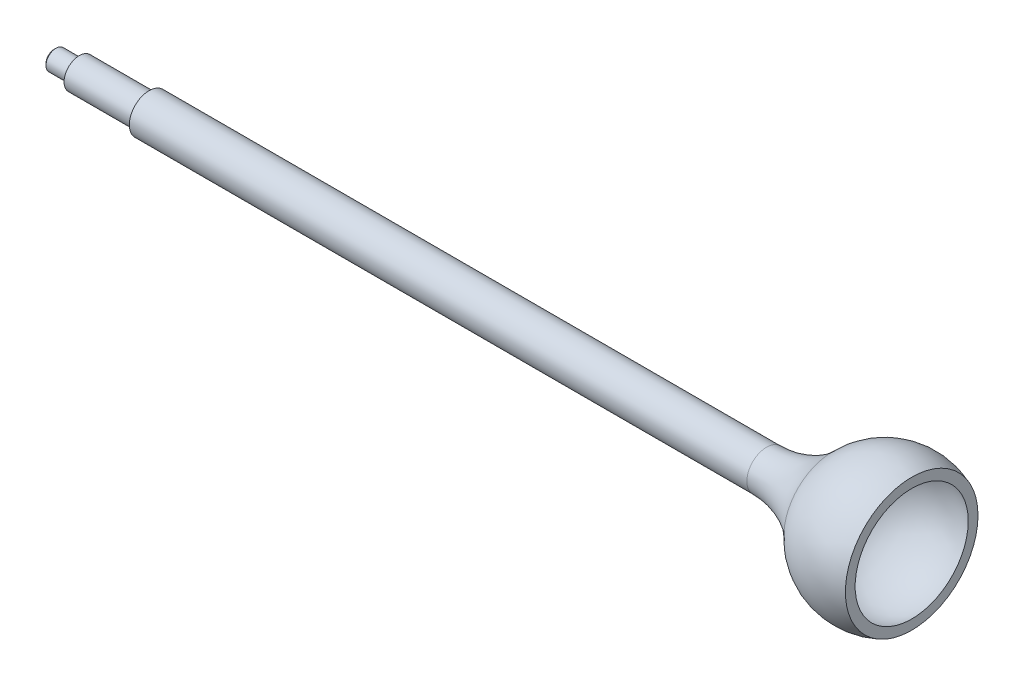
ISO-10303-21;
HEADER;
FILE_DESCRIPTION(('STEP AP214'),'2;1');
FILE_NAME('part.step','',(''),(''),'','','');
FILE_SCHEMA(('AUTOMOTIVE_DESIGN { 1 0 10303 214 1 1 1 1 }'));
ENDSEC;
DATA;
#1=APPLICATION_CONTEXT('core data for automotive mechanical design processes');
#2=APPLICATION_PROTOCOL_DEFINITION('international standard','automotive_design',2000,#1);
#3=PRODUCT_CONTEXT('',#1,'mechanical');
#4=PRODUCT('Part','Part','',(#3));
#5=PRODUCT_RELATED_PRODUCT_CATEGORY('part','',(#4));
#6=PRODUCT_DEFINITION_FORMATION('','',#4);
#7=PRODUCT_DEFINITION_CONTEXT('part definition',#1,'design');
#8=PRODUCT_DEFINITION('design','',#6,#7);
#9=PRODUCT_DEFINITION_SHAPE('','',#8);
#10=(LENGTH_UNIT() NAMED_UNIT(*) SI_UNIT(.MILLI.,.METRE.));
#11=(NAMED_UNIT(*) PLANE_ANGLE_UNIT() SI_UNIT($,.RADIAN.));
#12=(NAMED_UNIT(*) SI_UNIT($,.STERADIAN.) SOLID_ANGLE_UNIT());
#13=UNCERTAINTY_MEASURE_WITH_UNIT(LENGTH_MEASURE(1.E-05),#10,'distance_accuracy_value','');
#14=(GEOMETRIC_REPRESENTATION_CONTEXT(3) GLOBAL_UNCERTAINTY_ASSIGNED_CONTEXT((#13)) GLOBAL_UNIT_ASSIGNED_CONTEXT((#10,
#11,#12)) REPRESENTATION_CONTEXT('',''));
#15=CARTESIAN_POINT('',(0.,0.,0.));
#16=DIRECTION('',(0.,0.,1.));
#17=DIRECTION('',(1.,0.,0.));
#18=AXIS2_PLACEMENT_3D('',#15,#16,#17);
#19=CARTESIAN_POINT('',(411.5,0.,0.));
#20=DIRECTION('',(-1.,0.,0.));
#21=DIRECTION('',(0.,0.,-1.));
#22=AXIS2_PLACEMENT_3D('',#19,#20,#21);
#23=SPHERICAL_SURFACE('',#22,40.);
#24=CARTESIAN_POINT('',(382.089327543883,0.,0.));
#25=DIRECTION('',(1.,0.,0.));
#26=DIRECTION('',(0.,0.,-1.));
#27=AXIS2_PLACEMENT_3D('',#24,#25,#26);
#28=CIRCLE('',#27,27.1111111111111);
#29=CARTESIAN_POINT('',(382.089327543883,0.,-27.1111111111111));
#30=VERTEX_POINT('',#29);
#31=EDGE_CURVE('E48',#30,#30,#28,.T.);
#32=CARTESIAN_POINT('',(426.5,0.,0.));
#33=DIRECTION('',(-1.,0.,0.));
#34=DIRECTION('',(0.,0.,1.));
#35=AXIS2_PLACEMENT_3D('',#32,#33,#34);
#36=CIRCLE('',#35,37.0809924354783);
#37=CARTESIAN_POINT('',(426.5,0.,-37.0809924354783));
#38=VERTEX_POINT('',#37);
#39=EDGE_CURVE('E72',#38,#38,#36,.T.);
#40=CARTESIAN_POINT('',(382.089327543883,0.,-27.1111111111111));
#41=CARTESIAN_POINT('',(382.431166095148,0.,-27.4819515959781));
#42=CARTESIAN_POINT('',(382.780025288853,0.,-27.8463199316502));
#43=CARTESIAN_POINT('',(383.491270586963,0.,-28.5616061815372));
#44=CARTESIAN_POINT('',(383.853656691367,0.,-28.912524095752));
#45=CARTESIAN_POINT('',(384.591441436688,0.,-29.6004033796565));
#46=CARTESIAN_POINT('',(384.966840077606,0.,-29.9373647493461));
#47=CARTESIAN_POINT('',(385.730111719214,0.,-30.5968499449552));
#48=CARTESIAN_POINT('',(386.117984719904,0.,-30.9193737708747));
#49=CARTESIAN_POINT('',(386.905650446786,0.,-31.5495221538001));
#50=CARTESIAN_POINT('',(387.305443172979,0.,-31.8571467108062));
#51=CARTESIAN_POINT('',(388.116376290798,0.,-32.4570565172721));
#52=CARTESIAN_POINT('',(388.527516682425,0.,-32.7493417667319));
#53=CARTESIAN_POINT('',(389.36055693576,0.,-33.3181547661452));
#54=CARTESIAN_POINT('',(389.782456797467,0.,-33.5946825160986));
#55=CARTESIAN_POINT('',(390.636412375359,0.,-34.1315848952912));
#56=CARTESIAN_POINT('',(391.068468091543,0.,-34.3919595245304));
#57=CARTESIAN_POINT('',(391.942117240018,0.,-34.8961831441515));
#58=CARTESIAN_POINT('',(392.38371067231,0.,-35.1400321345333));
#59=CARTESIAN_POINT('',(393.27580346715,0.,-35.6108556033511));
#60=CARTESIAN_POINT('',(393.726302829698,0.,-35.837830081787));
#61=CARTESIAN_POINT('',(394.635562958049,0.,-36.2745797953899));
#62=CARTESIAN_POINT('',(395.094323723851,0.,-36.4843550305569));
#63=CARTESIAN_POINT('',(396.019450312019,0.,-36.8864061333049));
#64=CARTESIAN_POINT('',(396.485816134386,0.,-37.0786820008858));
#65=CARTESIAN_POINT('',(397.425485608516,0.,-37.4454592803625));
#66=CARTESIAN_POINT('',(397.898789260279,0.,-37.6199606922583));
#67=CARTESIAN_POINT('',(398.85165724011,0.,-37.9509394020974));
#68=CARTESIAN_POINT('',(399.331221568177,0.,-38.1074167000407));
#69=CARTESIAN_POINT('',(400.295924790407,0.,-38.4021233107118));
#70=CARTESIAN_POINT('',(400.781063684569,0.,-38.5403526234396));
#71=CARTESIAN_POINT('',(401.756221953277,0.,-38.7983654997157));
#72=CARTESIAN_POINT('',(402.246241327822,0.,-38.9181490632639));
#73=CARTESIAN_POINT('',(403.230459489106,0.,-39.1390990674545));
#74=CARTESIAN_POINT('',(403.724658275845,0.,-39.240265508097));
#75=CARTESIAN_POINT('',(404.716528213862,0.,-39.4238365281717));
#76=CARTESIAN_POINT('',(405.21419936514,0.,-39.5062411076039));
#77=CARTESIAN_POINT('',(406.212302016689,0.,-39.6521705094516));
#78=CARTESIAN_POINT('',(406.71273351696,0.,-39.7156953318671));
#79=CARTESIAN_POINT('',(407.71564090173,0.,-39.8237743350462));
#80=CARTESIAN_POINT('',(408.218116786229,0.,-39.86832851581));
#81=CARTESIAN_POINT('',(409.224394049799,0.,-39.9384024922467));
#82=CARTESIAN_POINT('',(409.72819542887,0.,-39.9639222879196));
#83=CARTESIAN_POINT('',(410.736402895557,0.,-39.9958909831449));
#84=CARTESIAN_POINT('',(411.240808983172,0.,-40.0023398826973));
#85=CARTESIAN_POINT('',(412.249504215746,0.,-39.9961575592357));
#86=CARTESIAN_POINT('',(412.753793360704,0.,-39.9835263362217));
#87=CARTESIAN_POINT('',(413.761533224141,0.,-39.939201839197));
#88=CARTESIAN_POINT('',(414.264983942618,0.,-39.9075085651863));
#89=CARTESIAN_POINT('',(415.270326668554,0.,-39.8251053090339));
#90=CARTESIAN_POINT('',(415.772218676011,0.,-39.7743953268921));
#91=CARTESIAN_POINT('',(416.773725926328,0.,-39.6540312069948));
#92=CARTESIAN_POINT('',(417.273341169186,0.,-39.5843770692392));
#93=CARTESIAN_POINT('',(418.269580090648,0.,-39.4262242844373));
#94=CARTESIAN_POINT('',(418.766203769252,0.,-39.3377256373909));
#95=CARTESIAN_POINT('',(419.75574905537,0.,-39.142010476527));
#96=CARTESIAN_POINT('',(420.248670662885,0.,-39.0347939627095));
#97=CARTESIAN_POINT('',(421.230106548736,0.,-38.8017963580599));
#98=CARTESIAN_POINT('',(421.718620827073,0.,-38.6760152672277));
#99=CARTESIAN_POINT('',(422.690543280366,0.,-38.40606885237));
#100=CARTESIAN_POINT('',(423.173951455322,0.,-38.2619035283445));
#101=CARTESIAN_POINT('',(424.134969567348,0.,-37.9553934501863));
#102=CARTESIAN_POINT('',(424.612579504418,0.,-37.7930486960537));
#103=CARTESIAN_POINT('',(425.561319785647,0.,-37.4504174480138));
#104=CARTESIAN_POINT('',(426.032450129806,0.,-37.2701309541066));
#105=CARTESIAN_POINT('',(426.5,0.,-37.0809924354783));
#106=B_SPLINE_CURVE_WITH_KNOTS('',3,(#40,#41,#42,#43,#44,#45,#46,#47,#48,#49,#50,#51,#52,#53,
#54,#55,#56,#57,#58,#59,#60,#61,#62,#63,#64,#65,#66,#67,#68,#69,#70,#71,#72,#73,#74,#75,#76,#77,
#78,#79,#80,#81,#82,#83,#84,#85,#86,#87,#88,#89,#90,#91,#92,#93,#94,#95,#96,#97,#98,#99,#100,
#101,#102,#103,#104,#105),.UNSPECIFIED.,.F.,.F.,(4,2,2,2,2,2,2,2,2,2,2,2,2,2,2,2,2,2,2,2,2,2,2,
2,2,2,2,2,2,2,2,2,4),(0.,1.5129810777724,3.0259621555448,4.53894323331724,6.05192431108964,
7.56490538886204,9.07788646663447,10.5908675444069,12.1038486221793,13.6168296999517,
15.1298107777241,16.6427918554965,18.155772933269,19.6687540110414,21.1817350888138,
22.6947161665862,24.2076972443586,25.720678322131,27.2336593999035,28.7466404776759,
30.2596215554483,31.7726026332207,33.2855837109931,34.7985647887655,36.311545866538,
37.8245269443104,39.3375080220828,40.8504890998552,42.3634701776276,43.8764512554001,
45.3894323331725,46.9024134109449,48.4153944887173),.UNSPECIFIED.);
#107=EDGE_CURVE('BSEAM40',#30,#38,#106,.T.);
#108=ORIENTED_EDGE('',*,*,#31,.T.);
#109=ORIENTED_EDGE('',*,*,#39,.T.);
#110=ORIENTED_EDGE('',*,*,#107,.T.);
#111=ORIENTED_EDGE('',*,*,#107,.F.);
#112=EDGE_LOOP('',(#108,#110,#109,#111));
#113=FACE_BOUND('',#112,.T.);
#114=ADVANCED_FACE('F40',(#113),#23,.T.);
#115=CARTESIAN_POINT('',(-53.,0.,0.));
#116=DIRECTION('',(-1.,0.,0.));
#117=DIRECTION('',(0.,0.,1.));
#118=AXIS2_PLACEMENT_3D('',#115,#116,#117);
#119=CYLINDRICAL_SURFACE('',#118,11.);
#120=CARTESIAN_POINT('',(345.325986973737,0.,0.));
#121=DIRECTION('',(1.,0.,0.));
#122=DIRECTION('',(0.,0.,-1.));
#123=AXIS2_PLACEMENT_3D('',#120,#121,#122);
#124=CIRCLE('',#123,11.);
#125=CARTESIAN_POINT('',(345.325986973737,0.,-11.));
#126=VERTEX_POINT('',#125);
#127=EDGE_CURVE('E10',#126,#126,#124,.F.);
#128=ORIENTED_EDGE('',*,*,#127,.T.);
#129=EDGE_LOOP('',(#128));
#130=FACE_BOUND('',#129,.T.);
#131=CARTESIAN_POINT('',(0.,0.,0.));
#132=DIRECTION('',(-1.,0.,0.));
#133=DIRECTION('',(0.,0.,1.));
#134=AXIS2_PLACEMENT_3D('',#131,#132,#133);
#135=CIRCLE('',#134,11.);
#136=CARTESIAN_POINT('',(0.,0.,11.));
#137=VERTEX_POINT('',#136);
#138=EDGE_CURVE('E66',#137,#137,#135,.T.);
#139=ORIENTED_EDGE('',*,*,#138,.F.);
#140=EDGE_LOOP('',(#139));
#141=FACE_BOUND('',#140,.T.);
#142=ADVANCED_FACE('F90',(#130,#141),#119,.T.);
#143=CARTESIAN_POINT('',(-53.,0.,0.));
#144=DIRECTION('',(-1.,0.,0.));
#145=DIRECTION('',(0.,0.,1.));
#146=AXIS2_PLACEMENT_3D('',#143,#144,#145);
#147=CYLINDRICAL_SURFACE('',#146,8.5);
#148=CARTESIAN_POINT('',(-39.,0.,0.));
#149=DIRECTION('',(-1.,0.,0.));
#150=DIRECTION('',(0.,0.,1.));
#151=AXIS2_PLACEMENT_3D('',#148,#149,#150);
#152=CIRCLE('',#151,8.5);
#153=CARTESIAN_POINT('',(-39.,0.,8.5));
#154=VERTEX_POINT('',#153);
#155=EDGE_CURVE('E60',#154,#154,#152,.T.);
#156=ORIENTED_EDGE('',*,*,#155,.F.);
#157=EDGE_LOOP('',(#156));
#158=FACE_BOUND('',#157,.T.);
#159=CARTESIAN_POINT('',(0.,0.,0.));
#160=DIRECTION('',(-1.,0.,0.));
#161=DIRECTION('',(0.,0.,1.));
#162=AXIS2_PLACEMENT_3D('',#159,#160,#161);
#163=CIRCLE('',#162,8.5);
#164=CARTESIAN_POINT('',(0.,0.,8.5));
#165=VERTEX_POINT('',#164);
#166=EDGE_CURVE('E69',#165,#165,#163,.T.);
#167=ORIENTED_EDGE('',*,*,#166,.T.);
#168=EDGE_LOOP('',(#167));
#169=FACE_BOUND('',#168,.T.);
#170=ADVANCED_FACE('F96',(#158,#169),#147,.T.);
#171=CARTESIAN_POINT('',(-39.,8.5,0.));
#172=DIRECTION('',(1.,0.,0.));
#173=DIRECTION('',(0.,0.,-1.));
#174=AXIS2_PLACEMENT_3D('',#171,#172,#173);
#175=PLANE('',#174);
#176=CARTESIAN_POINT('',(-39.,0.,0.));
#177=DIRECTION('',(-1.,0.,0.));
#178=DIRECTION('',(0.,0.,1.));
#179=AXIS2_PLACEMENT_3D('',#176,#177,#178);
#180=CIRCLE('',#179,5.6);
#181=CARTESIAN_POINT('',(-39.,0.,5.6));
#182=VERTEX_POINT('',#181);
#183=EDGE_CURVE('E63',#182,#182,#180,.T.);
#184=ORIENTED_EDGE('',*,*,#183,.F.);
#185=EDGE_LOOP('',(#184));
#186=FACE_BOUND('',#185,.T.);
#187=ORIENTED_EDGE('',*,*,#155,.T.);
#188=EDGE_LOOP('',(#187));
#189=FACE_BOUND('',#188,.T.);
#190=ADVANCED_FACE('F111',(#186,#189),#175,.F.);
#191=CARTESIAN_POINT('',(-53.,0.,0.));
#192=DIRECTION('',(-1.,0.,0.));
#193=DIRECTION('',(0.,0.,1.));
#194=AXIS2_PLACEMENT_3D('',#191,#192,#193);
#195=CYLINDRICAL_SURFACE('',#194,5.6);
#196=CARTESIAN_POINT('',(-52.,0.,0.));
#197=DIRECTION('',(1.,0.,0.));
#198=DIRECTION('',(0.,0.,-1.));
#199=AXIS2_PLACEMENT_3D('',#196,#197,#198);
#200=CIRCLE('',#199,5.6);
#201=CARTESIAN_POINT('',(-52.,0.,-5.6));
#202=VERTEX_POINT('',#201);
#203=EDGE_CURVE('E52',#202,#202,#200,.T.);
#204=ORIENTED_EDGE('',*,*,#203,.T.);
#205=EDGE_LOOP('',(#204));
#206=FACE_BOUND('',#205,.T.);
#207=ORIENTED_EDGE('',*,*,#183,.T.);
#208=EDGE_LOOP('',(#207));
#209=FACE_BOUND('',#208,.T.);
#210=ADVANCED_FACE('F107',(#206,#209),#195,.T.);
#211=CARTESIAN_POINT('',(-53.,5.6,0.));
#212=DIRECTION('',(1.,0.,0.));
#213=DIRECTION('',(0.,0.,-1.));
#214=AXIS2_PLACEMENT_3D('',#211,#212,#213);
#215=PLANE('',#214);
#216=CARTESIAN_POINT('',(-53.,0.,0.));
#217=DIRECTION('',(1.,0.,0.));
#218=DIRECTION('',(0.,0.,-1.));
#219=AXIS2_PLACEMENT_3D('',#216,#217,#218);
#220=CIRCLE('',#219,4.59999999999999);
#221=CARTESIAN_POINT('',(-53.,0.,-4.59999999999999));
#222=VERTEX_POINT('',#221);
#223=EDGE_CURVE('E57',#222,#222,#220,.F.);
#224=ORIENTED_EDGE('',*,*,#223,.T.);
#225=EDGE_LOOP('',(#224));
#226=FACE_BOUND('',#225,.T.);
#227=ADVANCED_FACE('F102',(#226),#215,.F.);
#228=CARTESIAN_POINT('',(0.,8.5,0.));
#229=DIRECTION('',(1.,0.,0.));
#230=DIRECTION('',(0.,0.,-1.));
#231=AXIS2_PLACEMENT_3D('',#228,#229,#230);
#232=PLANE('',#231);
#233=ORIENTED_EDGE('',*,*,#166,.F.);
#234=EDGE_LOOP('',(#233));
#235=FACE_BOUND('',#234,.T.);
#236=ORIENTED_EDGE('',*,*,#138,.T.);
#237=EDGE_LOOP('',(#236));
#238=FACE_BOUND('',#237,.T.);
#239=ADVANCED_FACE('F99',(#235,#238),#232,.F.);
#240=CARTESIAN_POINT('',(-53.,0.,0.));
#241=DIRECTION('',(1.,0.,0.));
#242=DIRECTION('',(0.,0.,-1.));
#243=AXIS2_PLACEMENT_3D('',#240,#241,#242);
#244=CONICAL_SURFACE('',#243,4.59999999999999,0.78539816339744);
#245=ORIENTED_EDGE('',*,*,#203,.F.);
#246=EDGE_LOOP('',(#245));
#247=FACE_BOUND('',#246,.T.);
#248=ORIENTED_EDGE('',*,*,#223,.F.);
#249=EDGE_LOOP('',(#248));
#250=FACE_BOUND('',#249,.T.);
#251=ADVANCED_FACE('F101',(#247,#250),#244,.T.);
#252=CARTESIAN_POINT('',(345.325986973737,0.,0.));
#253=DIRECTION('',(1.,0.,0.));
#254=DIRECTION('',(0.,0.,-1.));
#255=AXIS2_PLACEMENT_3D('',#252,#253,#254);
#256=TOROIDAL_SURFACE('',#255,61.,50.);
#257=ORIENTED_EDGE('',*,*,#127,.F.);
#258=EDGE_LOOP('',(#257));
#259=FACE_BOUND('',#258,.T.);
#260=ORIENTED_EDGE('',*,*,#31,.F.);
#261=EDGE_LOOP('',(#260));
#262=FACE_BOUND('',#261,.T.);
#263=ADVANCED_FACE('F42',(#259,#262),#256,.F.);
#264=CARTESIAN_POINT('',(426.5,0.,-37.0809924354783));
#265=DIRECTION('',(1.,0.,0.));
#266=DIRECTION('',(0.,0.,-1.));
#267=AXIS2_PLACEMENT_3D('',#264,#265,#266);
#268=PLANE('',#267);
#269=CARTESIAN_POINT('',(426.5,0.,0.));
#270=DIRECTION('',(1.,0.,0.));
#271=DIRECTION('',(0.,0.,-1.));
#272=AXIS2_PLACEMENT_3D('',#269,#270,#271);
#273=CIRCLE('',#272,31.6227766016838);
#274=CARTESIAN_POINT('',(426.5,0.,-31.6227766016838));
#275=VERTEX_POINT('',#274);
#276=EDGE_CURVE('E44',#275,#275,#273,.F.);
#277=ORIENTED_EDGE('',*,*,#276,.T.);
#278=EDGE_LOOP('',(#277));
#279=FACE_BOUND('',#278,.T.);
#280=ORIENTED_EDGE('',*,*,#39,.F.);
#281=EDGE_LOOP('',(#280));
#282=FACE_BOUND('',#281,.T.);
#283=ADVANCED_FACE('F79',(#279,#282),#268,.T.);
#284=CARTESIAN_POINT('',(411.5,0.,0.));
#285=DIRECTION('',(-1.,0.,0.));
#286=DIRECTION('',(0.,0.,-1.));
#287=AXIS2_PLACEMENT_3D('',#284,#285,#286);
#288=SPHERICAL_SURFACE('',#287,35.);
#289=ORIENTED_EDGE('',*,*,#276,.F.);
#290=EDGE_LOOP('',(#289));
#291=FACE_BOUND('',#290,.T.);
#292=ADVANCED_FACE('F82',(#291),#288,.F.);
#293=CLOSED_SHELL('',(#114,#142,#170,#190,#210,#227,#239,#251,#263,#283,#292));
#294=MANIFOLD_SOLID_BREP('B2',#293);
#295=ADVANCED_BREP_SHAPE_REPRESENTATION('',(#18,#294),#14);
#296=SHAPE_DEFINITION_REPRESENTATION(#9,#295);
ENDSEC;
END-ISO-10303-21;
